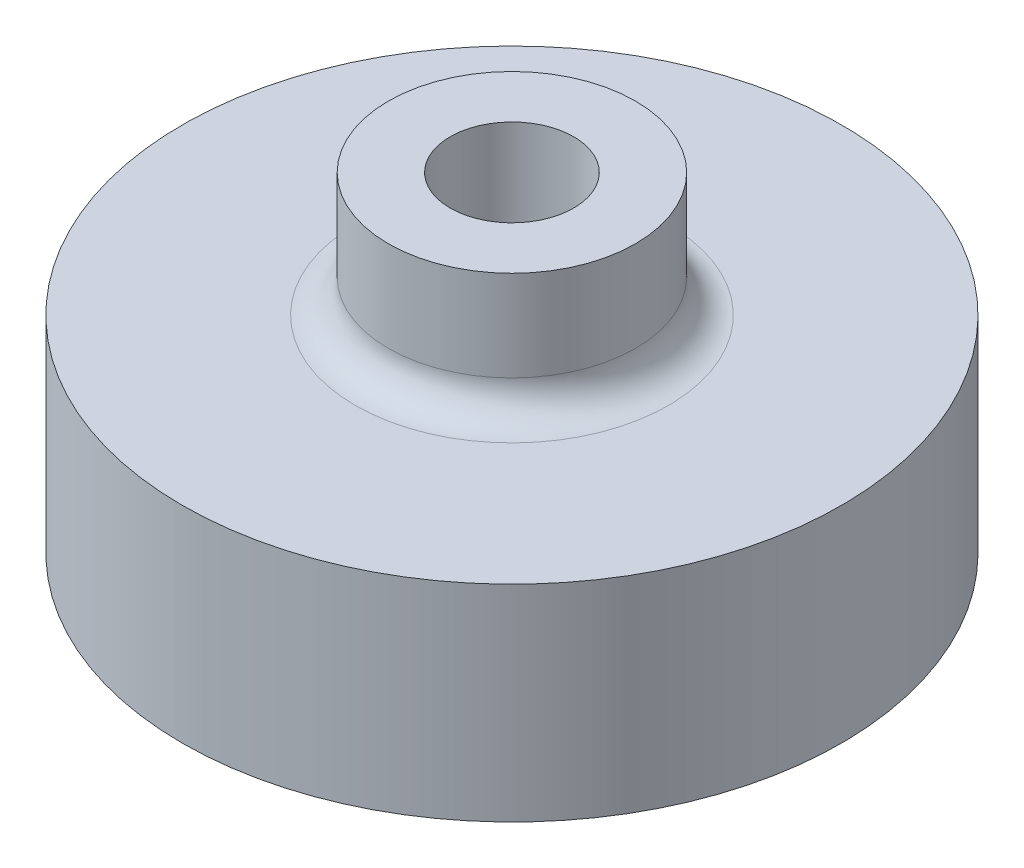
ISO-10303-21;
HEADER;
FILE_DESCRIPTION(('STEP AP214'),'2;1');
FILE_NAME('part.step','',(''),(''),'','','');
FILE_SCHEMA(('AUTOMOTIVE_DESIGN { 1 0 10303 214 1 1 1 1 }'));
ENDSEC;
DATA;
#1=APPLICATION_CONTEXT('core data for automotive mechanical design processes');
#2=APPLICATION_PROTOCOL_DEFINITION('international standard','automotive_design',2000,#1);
#3=PRODUCT_CONTEXT('',#1,'mechanical');
#4=PRODUCT('Part','Part','',(#3));
#5=PRODUCT_RELATED_PRODUCT_CATEGORY('part','',(#4));
#6=PRODUCT_DEFINITION_FORMATION('','',#4);
#7=PRODUCT_DEFINITION_CONTEXT('part definition',#1,'design');
#8=PRODUCT_DEFINITION('design','',#6,#7);
#9=PRODUCT_DEFINITION_SHAPE('','',#8);
#10=(LENGTH_UNIT() NAMED_UNIT(*) SI_UNIT(.MILLI.,.METRE.));
#11=(NAMED_UNIT(*) PLANE_ANGLE_UNIT() SI_UNIT($,.RADIAN.));
#12=(NAMED_UNIT(*) SI_UNIT($,.STERADIAN.) SOLID_ANGLE_UNIT());
#13=UNCERTAINTY_MEASURE_WITH_UNIT(LENGTH_MEASURE(1.E-05),#10,'distance_accuracy_value','');
#14=(GEOMETRIC_REPRESENTATION_CONTEXT(3) GLOBAL_UNCERTAINTY_ASSIGNED_CONTEXT((#13)) GLOBAL_UNIT_ASSIGNED_CONTEXT((#10,
#11,#12)) REPRESENTATION_CONTEXT('',''));
#15=CARTESIAN_POINT('',(0.,0.,0.));
#16=DIRECTION('',(0.,0.,1.));
#17=DIRECTION('',(1.,0.,0.));
#18=AXIS2_PLACEMENT_3D('',#15,#16,#17);
#19=CARTESIAN_POINT('',(0.,125.,0.));
#20=DIRECTION('',(0.,1.,0.));
#21=DIRECTION('',(0.,0.,1.));
#22=AXIS2_PLACEMENT_3D('',#19,#20,#21);
#23=PLANE('',#22);
#24=DIRECTION('',(0.,0.,-1.));
#25=VECTOR('',#24,1.);
#26=CARTESIAN_POINT('',(-50.,125.,0.));
#27=LINE('',#26,#25);
#28=CARTESIAN_POINT('',(-50.,125.,180.710403685012));
#29=VERTEX_POINT('',#28);
#30=CARTESIAN_POINT('',(-50.,125.,-180.710403685012));
#31=VERTEX_POINT('',#30);
#32=EDGE_CURVE('E73',#29,#31,#27,.T.);
#33=ORIENTED_EDGE('',*,*,#32,.F.);
#34=CARTESIAN_POINT('',(0.,125.,0.));
#35=DIRECTION('',(0.,1.,0.));
#36=DIRECTION('',(0.,0.,1.));
#37=AXIS2_PLACEMENT_3D('',#34,#35,#36);
#38=CIRCLE('',#37,187.5);
#39=CARTESIAN_POINT('',(48.087593771605,125.,181.228676884364));
#40=VERTEX_POINT('',#39);
#41=EDGE_CURVE('E95',#29,#40,#38,.T.);
#42=ORIENTED_EDGE('',*,*,#41,.T.);
#43=DIRECTION('',(0.,0.,-1.));
#44=VECTOR('',#43,1.);
#45=CARTESIAN_POINT('',(48.087593771605,125.,0.));
#46=LINE('',#45,#44);
#47=CARTESIAN_POINT('',(48.087593771605,125.,-181.228676884364));
#48=VERTEX_POINT('',#47);
#49=EDGE_CURVE('E93',#40,#48,#46,.T.);
#50=ORIENTED_EDGE('',*,*,#49,.T.);
#51=EDGE_CURVE('E88',#48,#31,#38,.T.);
#52=ORIENTED_EDGE('',*,*,#51,.T.);
#53=EDGE_LOOP('',(#33,#42,#50,#52));
#54=FACE_BOUND('',#53,.T.);
#55=ADVANCED_FACE('F34',(#54),#23,.T.);
#56=CARTESIAN_POINT('',(0.,0.,0.));
#57=DIRECTION('',(0.,1.,0.));
#58=DIRECTION('',(0.,0.,1.));
#59=AXIS2_PLACEMENT_3D('',#56,#57,#58);
#60=PLANE('',#59);
#61=CARTESIAN_POINT('',(0.,0.,0.));
#62=DIRECTION('',(0.,1.,0.));
#63=DIRECTION('',(0.,0.,1.));
#64=AXIS2_PLACEMENT_3D('',#61,#62,#63);
#65=CIRCLE('',#64,1000.);
#66=CARTESIAN_POINT('',(0.,0.,1000.));
#67=VERTEX_POINT('',#66);
#68=EDGE_CURVE('E98',#67,#67,#65,.T.);
#69=ORIENTED_EDGE('',*,*,#68,.F.);
#70=EDGE_LOOP('',(#69));
#71=FACE_BOUND('',#70,.T.);
#72=CARTESIAN_POINT('',(0.,0.,0.));
#73=DIRECTION('',(0.,-1.,0.));
#74=DIRECTION('',(0.,0.,-1.));
#75=AXIS2_PLACEMENT_3D('',#72,#73,#74);
#76=CIRCLE('',#75,187.5);
#77=CARTESIAN_POINT('',(48.087593771605,0.,-181.228676884364));
#78=VERTEX_POINT('',#77);
#79=CARTESIAN_POINT('',(48.087593771605,0.,181.228676884364));
#80=VERTEX_POINT('',#79);
#81=EDGE_CURVE('E156',#78,#80,#76,.T.);
#82=ORIENTED_EDGE('',*,*,#81,.F.);
#83=DIRECTION('',(0.,0.,-1.));
#84=VECTOR('',#83,1.);
#85=CARTESIAN_POINT('',(48.087593771605,0.,0.));
#86=LINE('',#85,#84);
#87=EDGE_CURVE('E164',#80,#78,#86,.T.);
#88=ORIENTED_EDGE('',*,*,#87,.F.);
#89=EDGE_LOOP('',(#82,#88));
#90=FACE_BOUND('',#89,.T.);
#91=DIRECTION('',(0.,0.,-1.));
#92=VECTOR('',#91,1.);
#93=CARTESIAN_POINT('',(-50.,0.,0.));
#94=LINE('',#93,#92);
#95=CARTESIAN_POINT('',(-50.,0.,180.710403685012));
#96=VERTEX_POINT('',#95);
#97=CARTESIAN_POINT('',(-50.,0.,-180.710403685012));
#98=VERTEX_POINT('',#97);
#99=EDGE_CURVE('E157',#96,#98,#94,.T.);
#100=ORIENTED_EDGE('',*,*,#99,.T.);
#101=CARTESIAN_POINT('',(0.,0.,0.));
#102=DIRECTION('',(0.,-1.,0.));
#103=DIRECTION('',(0.,0.,-1.));
#104=AXIS2_PLACEMENT_3D('',#101,#102,#103);
#105=CIRCLE('',#104,187.5);
#106=EDGE_CURVE('E82',#96,#98,#105,.T.);
#107=ORIENTED_EDGE('',*,*,#106,.F.);
#108=EDGE_LOOP('',(#100,#107));
#109=FACE_BOUND('',#108,.T.);
#110=ADVANCED_FACE('F128',(#71,#90,#109),#60,.F.);
#111=CARTESIAN_POINT('',(0.,625.,0.));
#112=DIRECTION('',(0.,-1.,0.));
#113=DIRECTION('',(0.,0.,-1.));
#114=AXIS2_PLACEMENT_3D('',#111,#112,#113);
#115=CYLINDRICAL_SURFACE('',#114,1000.);
#116=CARTESIAN_POINT('',(0.,625.,0.));
#117=DIRECTION('',(0.,1.,0.));
#118=DIRECTION('',(0.,0.,1.));
#119=AXIS2_PLACEMENT_3D('',#116,#117,#118);
#120=CIRCLE('',#119,1000.);
#121=CARTESIAN_POINT('',(0.,625.,1000.));
#122=VERTEX_POINT('',#121);
#123=EDGE_CURVE('E105',#122,#122,#120,.T.);
#124=ORIENTED_EDGE('',*,*,#123,.F.);
#125=EDGE_LOOP('',(#124));
#126=FACE_BOUND('',#125,.T.);
#127=ORIENTED_EDGE('',*,*,#68,.T.);
#128=EDGE_LOOP('',(#127));
#129=FACE_BOUND('',#128,.T.);
#130=ADVANCED_FACE('F133',(#126,#129),#115,.T.);
#131=CARTESIAN_POINT('',(0.,625.,0.));
#132=DIRECTION('',(0.,1.,0.));
#133=DIRECTION('',(0.,0.,1.));
#134=AXIS2_PLACEMENT_3D('',#131,#132,#133);
#135=PLANE('',#134);
#136=CARTESIAN_POINT('',(0.,625.,0.));
#137=DIRECTION('',(0.,1.,0.));
#138=DIRECTION('',(0.,0.,1.));
#139=AXIS2_PLACEMENT_3D('',#136,#137,#138);
#140=CIRCLE('',#139,475.);
#141=CARTESIAN_POINT('',(0.,625.,475.));
#142=VERTEX_POINT('',#141);
#143=EDGE_CURVE('E12',#142,#142,#140,.F.);
#144=ORIENTED_EDGE('',*,*,#143,.T.);
#145=EDGE_LOOP('',(#144));
#146=FACE_BOUND('',#145,.T.);
#147=ORIENTED_EDGE('',*,*,#123,.T.);
#148=EDGE_LOOP('',(#147));
#149=FACE_BOUND('',#148,.T.);
#150=ADVANCED_FACE('F141',(#146,#149),#135,.T.);
#151=CARTESIAN_POINT('',(0.,1000.,0.));
#152=DIRECTION('',(0.,-1.,0.));
#153=DIRECTION('',(0.,0.,-1.));
#154=AXIS2_PLACEMENT_3D('',#151,#152,#153);
#155=CYLINDRICAL_SURFACE('',#154,375.);
#156=CARTESIAN_POINT('',(0.,725.,0.));
#157=DIRECTION('',(0.,1.,0.));
#158=DIRECTION('',(0.,0.,1.));
#159=AXIS2_PLACEMENT_3D('',#156,#157,#158);
#160=CIRCLE('',#159,375.);
#161=CARTESIAN_POINT('',(0.,725.,375.));
#162=VERTEX_POINT('',#161);
#163=EDGE_CURVE('E42',#162,#162,#160,.T.);
#164=ORIENTED_EDGE('',*,*,#163,.T.);
#165=EDGE_LOOP('',(#164));
#166=FACE_BOUND('',#165,.T.);
#167=CARTESIAN_POINT('',(0.,1000.,0.));
#168=DIRECTION('',(0.,1.,0.));
#169=DIRECTION('',(0.,0.,1.));
#170=AXIS2_PLACEMENT_3D('',#167,#168,#169);
#171=CIRCLE('',#170,375.);
#172=CARTESIAN_POINT('',(0.,1000.,375.));
#173=VERTEX_POINT('',#172);
#174=EDGE_CURVE('E94',#173,#173,#171,.T.);
#175=ORIENTED_EDGE('',*,*,#174,.F.);
#176=EDGE_LOOP('',(#175));
#177=FACE_BOUND('',#176,.T.);
#178=ADVANCED_FACE('F112',(#166,#177),#155,.T.);
#179=CARTESIAN_POINT('',(0.,1000.,0.));
#180=DIRECTION('',(0.,1.,0.));
#181=DIRECTION('',(0.,0.,1.));
#182=AXIS2_PLACEMENT_3D('',#179,#180,#181);
#183=PLANE('',#182);
#184=CARTESIAN_POINT('',(0.,1000.,0.));
#185=DIRECTION('',(0.,1.,0.));
#186=DIRECTION('',(0.,0.,1.));
#187=AXIS2_PLACEMENT_3D('',#184,#185,#186);
#188=CIRCLE('',#187,187.5);
#189=CARTESIAN_POINT('',(0.,1000.,187.5));
#190=VERTEX_POINT('',#189);
#191=EDGE_CURVE('E91',#190,#190,#188,.T.);
#192=ORIENTED_EDGE('',*,*,#191,.F.);
#193=EDGE_LOOP('',(#192));
#194=FACE_BOUND('',#193,.T.);
#195=ORIENTED_EDGE('',*,*,#174,.T.);
#196=EDGE_LOOP('',(#195));
#197=FACE_BOUND('',#196,.T.);
#198=ADVANCED_FACE('F116',(#194,#197),#183,.T.);
#199=CARTESIAN_POINT('',(0.,725.,0.));
#200=DIRECTION('',(0.,1.,0.));
#201=DIRECTION('',(0.,0.,1.));
#202=AXIS2_PLACEMENT_3D('',#199,#200,#201);
#203=TOROIDAL_SURFACE('',#202,475.,100.);
#204=ORIENTED_EDGE('',*,*,#143,.F.);
#205=EDGE_LOOP('',(#204));
#206=FACE_BOUND('',#205,.T.);
#207=ORIENTED_EDGE('',*,*,#163,.F.);
#208=EDGE_LOOP('',(#207));
#209=FACE_BOUND('',#208,.T.);
#210=ADVANCED_FACE('F36',(#206,#209),#203,.F.);
#211=CARTESIAN_POINT('',(0.,125.,0.));
#212=DIRECTION('',(0.,1.,0.));
#213=DIRECTION('',(0.,0.,1.));
#214=AXIS2_PLACEMENT_3D('',#211,#212,#213);
#215=CYLINDRICAL_SURFACE('',#214,187.5);
#216=ORIENTED_EDGE('',*,*,#51,.F.);
#217=DIRECTION('',(0.,-1.,0.));
#218=VECTOR('',#217,1.);
#219=CARTESIAN_POINT('',(48.087593771605,125.,-181.228676884364));
#220=LINE('',#219,#218);
#221=EDGE_CURVE('E57',#48,#78,#220,.T.);
#222=ORIENTED_EDGE('',*,*,#221,.T.);
#223=ORIENTED_EDGE('',*,*,#81,.T.);
#224=DIRECTION('',(0.,-1.,0.));
#225=VECTOR('',#224,1.);
#226=CARTESIAN_POINT('',(48.087593771605,125.,181.228676884364));
#227=LINE('',#226,#225);
#228=EDGE_CURVE('E158',#40,#80,#227,.T.);
#229=ORIENTED_EDGE('',*,*,#228,.F.);
#230=ORIENTED_EDGE('',*,*,#41,.F.);
#231=DIRECTION('',(0.,-1.,0.));
#232=VECTOR('',#231,1.);
#233=CARTESIAN_POINT('',(-50.,125.,180.710403685012));
#234=LINE('',#233,#232);
#235=EDGE_CURVE('E49',#29,#96,#234,.T.);
#236=ORIENTED_EDGE('',*,*,#235,.T.);
#237=ORIENTED_EDGE('',*,*,#106,.T.);
#238=DIRECTION('',(0.,-1.,0.));
#239=VECTOR('',#238,1.);
#240=CARTESIAN_POINT('',(-50.,125.,-180.710403685012));
#241=LINE('',#240,#239);
#242=EDGE_CURVE('E76',#31,#98,#241,.T.);
#243=ORIENTED_EDGE('',*,*,#242,.F.);
#244=EDGE_LOOP('',(#216,#222,#223,#229,#230,#236,#237,#243));
#245=FACE_BOUND('',#244,.T.);
#246=ORIENTED_EDGE('',*,*,#191,.T.);
#247=EDGE_LOOP('',(#246));
#248=FACE_BOUND('',#247,.T.);
#249=ADVANCED_FACE('F86',(#245,#248),#215,.F.);
#250=CARTESIAN_POINT('',(48.087593771605,125.,0.));
#251=DIRECTION('',(-1.,0.,0.));
#252=DIRECTION('',(0.,0.,1.));
#253=AXIS2_PLACEMENT_3D('',#250,#251,#252);
#254=PLANE('',#253);
#255=ORIENTED_EDGE('',*,*,#87,.T.);
#256=ORIENTED_EDGE('',*,*,#221,.F.);
#257=ORIENTED_EDGE('',*,*,#49,.F.);
#258=ORIENTED_EDGE('',*,*,#228,.T.);
#259=EDGE_LOOP('',(#255,#256,#257,#258));
#260=FACE_BOUND('',#259,.T.);
#261=ADVANCED_FACE('F122',(#260),#254,.F.);
#262=CARTESIAN_POINT('',(-50.,125.,0.));
#263=DIRECTION('',(-1.,0.,0.));
#264=DIRECTION('',(0.,0.,1.));
#265=AXIS2_PLACEMENT_3D('',#262,#263,#264);
#266=PLANE('',#265);
#267=ORIENTED_EDGE('',*,*,#99,.F.);
#268=ORIENTED_EDGE('',*,*,#235,.F.);
#269=ORIENTED_EDGE('',*,*,#32,.T.);
#270=ORIENTED_EDGE('',*,*,#242,.T.);
#271=EDGE_LOOP('',(#267,#268,#269,#270));
#272=FACE_BOUND('',#271,.T.);
#273=ADVANCED_FACE('F75',(#272),#266,.T.);
#274=CLOSED_SHELL('',(#55,#110,#130,#150,#178,#198,#210,#249,#261,#273));
#275=MANIFOLD_SOLID_BREP('B2',#274);
#276=ADVANCED_BREP_SHAPE_REPRESENTATION('',(#18,#275),#14);
#277=SHAPE_DEFINITION_REPRESENTATION(#9,#276);
ENDSEC;
END-ISO-10303-21;
